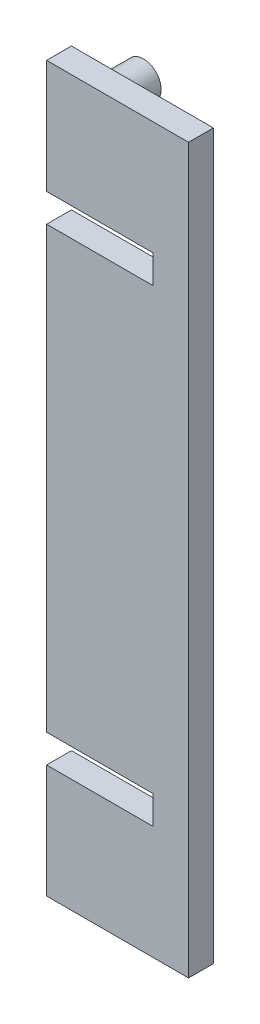
ISO-10303-21;
HEADER;
FILE_DESCRIPTION(('STEP AP214'),'2;1');
FILE_NAME('part.step','',(''),(''),'','','');
FILE_SCHEMA(('AUTOMOTIVE_DESIGN { 1 0 10303 214 1 1 1 1 }'));
ENDSEC;
DATA;
#1=APPLICATION_CONTEXT('core data for automotive mechanical design processes');
#2=APPLICATION_PROTOCOL_DEFINITION('international standard','automotive_design',2000,#1);
#3=PRODUCT_CONTEXT('',#1,'mechanical');
#4=PRODUCT('Part','Part','',(#3));
#5=PRODUCT_RELATED_PRODUCT_CATEGORY('part','',(#4));
#6=PRODUCT_DEFINITION_FORMATION('','',#4);
#7=PRODUCT_DEFINITION_CONTEXT('part definition',#1,'design');
#8=PRODUCT_DEFINITION('design','',#6,#7);
#9=PRODUCT_DEFINITION_SHAPE('','',#8);
#10=(LENGTH_UNIT() NAMED_UNIT(*) SI_UNIT(.MILLI.,.METRE.));
#11=(NAMED_UNIT(*) PLANE_ANGLE_UNIT() SI_UNIT($,.RADIAN.));
#12=(NAMED_UNIT(*) SI_UNIT($,.STERADIAN.) SOLID_ANGLE_UNIT());
#13=UNCERTAINTY_MEASURE_WITH_UNIT(LENGTH_MEASURE(1.E-05),#10,'distance_accuracy_value','');
#14=(GEOMETRIC_REPRESENTATION_CONTEXT(3) GLOBAL_UNCERTAINTY_ASSIGNED_CONTEXT((#13)) GLOBAL_UNIT_ASSIGNED_CONTEXT((#10,
#11,#12)) REPRESENTATION_CONTEXT('',''));
#15=CARTESIAN_POINT('',(0.,0.,0.));
#16=DIRECTION('',(0.,0.,1.));
#17=DIRECTION('',(1.,0.,0.));
#18=AXIS2_PLACEMENT_3D('',#15,#16,#17);
#19=CARTESIAN_POINT('',(3.18498825543047,0.,3.5));
#20=DIRECTION('',(-1.,0.,0.));
#21=DIRECTION('',(0.,0.,1.));
#22=AXIS2_PLACEMENT_3D('',#19,#20,#21);
#23=PLANE('',#22);
#24=DIRECTION('',(0.,1.,0.));
#25=VECTOR('',#24,1.);
#26=CARTESIAN_POINT('',(3.18498825543047,0.,3.5));
#27=LINE('',#26,#25);
#28=CARTESIAN_POINT('',(3.18498825543047,39.174258775512,3.5));
#29=VERTEX_POINT('',#28);
#30=CARTESIAN_POINT('',(3.18498825543047,43.174258775512,3.5));
#31=VERTEX_POINT('',#30);
#32=EDGE_CURVE('E195',#29,#31,#27,.T.);
#33=ORIENTED_EDGE('',*,*,#32,.T.);
#34=DIRECTION('',(0.,0.,1.));
#35=VECTOR('',#34,1.);
#36=CARTESIAN_POINT('',(3.18498825543047,43.174258775512,0.));
#37=LINE('',#36,#35);
#38=CARTESIAN_POINT('',(3.18498825543047,43.174258775512,0.));
#39=VERTEX_POINT('',#38);
#40=EDGE_CURVE('E152',#39,#31,#37,.T.);
#41=ORIENTED_EDGE('',*,*,#40,.F.);
#42=DIRECTION('',(0.,1.,0.));
#43=VECTOR('',#42,1.);
#44=CARTESIAN_POINT('',(3.18498825543047,0.,0.));
#45=LINE('',#44,#43);
#46=CARTESIAN_POINT('',(3.18498825543047,39.174258775512,0.));
#47=VERTEX_POINT('',#46);
#48=EDGE_CURVE('E158',#47,#39,#45,.T.);
#49=ORIENTED_EDGE('',*,*,#48,.F.);
#50=DIRECTION('',(0.,0.,-1.));
#51=VECTOR('',#50,1.);
#52=CARTESIAN_POINT('',(3.18498825543047,39.174258775512,3.5));
#53=LINE('',#52,#51);
#54=EDGE_CURVE('E229',#29,#47,#53,.T.);
#55=ORIENTED_EDGE('',*,*,#54,.F.);
#56=EDGE_LOOP('',(#33,#41,#49,#55));
#57=FACE_BOUND('',#56,.T.);
#58=ADVANCED_FACE('F43',(#57),#23,.T.);
#59=CARTESIAN_POINT('',(3.18498825543047,0.,3.5));
#60=DIRECTION('',(1.,0.,0.));
#61=DIRECTION('',(0.,0.,-1.));
#62=AXIS2_PLACEMENT_3D('',#59,#60,#61);
#63=PLANE('',#62);
#64=DIRECTION('',(0.,0.,-1.));
#65=VECTOR('',#64,1.);
#66=CARTESIAN_POINT('',(3.18498825543047,-26.825741224488,0.));
#67=LINE('',#66,#65);
#68=CARTESIAN_POINT('',(3.18498825543047,-26.825741224488,3.5));
#69=VERTEX_POINT('',#68);
#70=CARTESIAN_POINT('',(3.18498825543047,-26.825741224488,0.));
#71=VERTEX_POINT('',#70);
#72=EDGE_CURVE('E58',#69,#71,#67,.T.);
#73=ORIENTED_EDGE('',*,*,#72,.F.);
#74=DIRECTION('',(0.,-1.,0.));
#75=VECTOR('',#74,1.);
#76=CARTESIAN_POINT('',(3.18498825543047,0.,3.5));
#77=LINE('',#76,#75);
#78=CARTESIAN_POINT('',(3.18498825543047,-22.825741224488,3.5));
#79=VERTEX_POINT('',#78);
#80=EDGE_CURVE('E206',#79,#69,#77,.T.);
#81=ORIENTED_EDGE('',*,*,#80,.F.);
#82=DIRECTION('',(0.,0.,-1.));
#83=VECTOR('',#82,1.);
#84=CARTESIAN_POINT('',(3.18498825543047,-22.825741224488,3.5));
#85=LINE('',#84,#83);
#86=CARTESIAN_POINT('',(3.18498825543047,-22.825741224488,0.));
#87=VERTEX_POINT('',#86);
#88=EDGE_CURVE('E211',#79,#87,#85,.T.);
#89=ORIENTED_EDGE('',*,*,#88,.T.);
#90=DIRECTION('',(0.,-1.,0.));
#91=VECTOR('',#90,1.);
#92=CARTESIAN_POINT('',(3.18498825543047,0.,0.));
#93=LINE('',#92,#91);
#94=EDGE_CURVE('E63',#87,#71,#93,.T.);
#95=ORIENTED_EDGE('',*,*,#94,.T.);
#96=EDGE_LOOP('',(#73,#81,#89,#95));
#97=FACE_BOUND('',#96,.T.);
#98=ADVANCED_FACE('F271',(#97),#63,.F.);
#99=CARTESIAN_POINT('',(0.,59.174258775512,3.5));
#100=DIRECTION('',(0.,1.,0.));
#101=DIRECTION('',(0.,0.,1.));
#102=AXIS2_PLACEMENT_3D('',#99,#100,#101);
#103=PLANE('',#102);
#104=DIRECTION('',(0.,0.,1.));
#105=VECTOR('',#104,1.);
#106=CARTESIAN_POINT('',(8.18498825543047,59.174258775512,0.));
#107=LINE('',#106,#105);
#108=CARTESIAN_POINT('',(8.18498825543047,59.174258775512,0.));
#109=VERTEX_POINT('',#108);
#110=CARTESIAN_POINT('',(8.18498825543047,59.174258775512,3.5));
#111=VERTEX_POINT('',#110);
#112=EDGE_CURVE('E185',#109,#111,#107,.T.);
#113=ORIENTED_EDGE('',*,*,#112,.F.);
#114=DIRECTION('',(1.,0.,0.));
#115=VECTOR('',#114,1.);
#116=CARTESIAN_POINT('',(0.,59.174258775512,0.));
#117=LINE('',#116,#115);
#118=CARTESIAN_POINT('',(-11.8150117445695,59.174258775512,0.));
#119=VERTEX_POINT('',#118);
#120=EDGE_CURVE('E190',#119,#109,#117,.T.);
#121=ORIENTED_EDGE('',*,*,#120,.F.);
#122=DIRECTION('',(0.,0.,-1.));
#123=VECTOR('',#122,1.);
#124=CARTESIAN_POINT('',(-11.8150117445695,59.174258775512,0.));
#125=LINE('',#124,#123);
#126=CARTESIAN_POINT('',(-11.8150117445695,59.174258775512,3.5));
#127=VERTEX_POINT('',#126);
#128=EDGE_CURVE('E149',#127,#119,#125,.T.);
#129=ORIENTED_EDGE('',*,*,#128,.F.);
#130=DIRECTION('',(1.,0.,0.));
#131=VECTOR('',#130,1.);
#132=CARTESIAN_POINT('',(0.,59.174258775512,3.5));
#133=LINE('',#132,#131);
#134=EDGE_CURVE('E192',#127,#111,#133,.T.);
#135=ORIENTED_EDGE('',*,*,#134,.T.);
#136=EDGE_LOOP('',(#113,#121,#129,#135));
#137=FACE_BOUND('',#136,.T.);
#138=ADVANCED_FACE('F45',(#137),#103,.T.);
#139=CARTESIAN_POINT('',(0.,39.174258775512,3.5));
#140=DIRECTION('',(0.,1.,0.));
#141=DIRECTION('',(0.,0.,1.));
#142=AXIS2_PLACEMENT_3D('',#139,#140,#141);
#143=PLANE('',#142);
#144=DIRECTION('',(1.,0.,0.));
#145=VECTOR('',#144,1.);
#146=CARTESIAN_POINT('',(0.,39.174258775512,0.));
#147=LINE('',#146,#145);
#148=CARTESIAN_POINT('',(-11.8150117445695,39.174258775512,0.));
#149=VERTEX_POINT('',#148);
#150=EDGE_CURVE('E214',#149,#47,#147,.T.);
#151=ORIENTED_EDGE('',*,*,#150,.F.);
#152=DIRECTION('',(0.,0.,-1.));
#153=VECTOR('',#152,1.);
#154=CARTESIAN_POINT('',(-11.8150117445695,39.174258775512,3.5));
#155=LINE('',#154,#153);
#156=CARTESIAN_POINT('',(-11.8150117445695,39.174258775512,3.5));
#157=VERTEX_POINT('',#156);
#158=EDGE_CURVE('E227',#157,#149,#155,.T.);
#159=ORIENTED_EDGE('',*,*,#158,.F.);
#160=DIRECTION('',(1.,0.,0.));
#161=VECTOR('',#160,1.);
#162=CARTESIAN_POINT('',(0.,39.174258775512,3.5));
#163=LINE('',#162,#161);
#164=EDGE_CURVE('E199',#157,#29,#163,.T.);
#165=ORIENTED_EDGE('',*,*,#164,.T.);
#166=ORIENTED_EDGE('',*,*,#54,.T.);
#167=EDGE_LOOP('',(#151,#159,#165,#166));
#168=FACE_BOUND('',#167,.T.);
#169=ADVANCED_FACE('F279',(#168),#143,.T.);
#170=CARTESIAN_POINT('',(-11.8150117445695,0.,3.5));
#171=DIRECTION('',(1.,0.,0.));
#172=DIRECTION('',(0.,0.,-1.));
#173=AXIS2_PLACEMENT_3D('',#170,#171,#172);
#174=PLANE('',#173);
#175=DIRECTION('',(0.,-1.,0.));
#176=VECTOR('',#175,1.);
#177=CARTESIAN_POINT('',(-11.8150117445695,0.,0.));
#178=LINE('',#177,#176);
#179=CARTESIAN_POINT('',(-11.8150117445695,-22.825741224488,0.));
#180=VERTEX_POINT('',#179);
#181=EDGE_CURVE('E216',#149,#180,#178,.T.);
#182=ORIENTED_EDGE('',*,*,#181,.T.);
#183=DIRECTION('',(0.,0.,-1.));
#184=VECTOR('',#183,1.);
#185=CARTESIAN_POINT('',(-11.8150117445695,-22.825741224488,3.5));
#186=LINE('',#185,#184);
#187=CARTESIAN_POINT('',(-11.8150117445695,-22.825741224488,3.5));
#188=VERTEX_POINT('',#187);
#189=EDGE_CURVE('E224',#188,#180,#186,.T.);
#190=ORIENTED_EDGE('',*,*,#189,.F.);
#191=DIRECTION('',(0.,-1.,0.));
#192=VECTOR('',#191,1.);
#193=CARTESIAN_POINT('',(-11.8150117445695,0.,3.5));
#194=LINE('',#193,#192);
#195=EDGE_CURVE('E202',#157,#188,#194,.T.);
#196=ORIENTED_EDGE('',*,*,#195,.F.);
#197=ORIENTED_EDGE('',*,*,#158,.T.);
#198=EDGE_LOOP('',(#182,#190,#196,#197));
#199=FACE_BOUND('',#198,.T.);
#200=ADVANCED_FACE('F282',(#199),#174,.F.);
#201=CARTESIAN_POINT('',(0.,-22.825741224488,3.5));
#202=DIRECTION('',(0.,1.,0.));
#203=DIRECTION('',(0.,0.,1.));
#204=AXIS2_PLACEMENT_3D('',#201,#202,#203);
#205=PLANE('',#204);
#206=DIRECTION('',(1.,0.,0.));
#207=VECTOR('',#206,1.);
#208=CARTESIAN_POINT('',(0.,-22.825741224488,0.));
#209=LINE('',#208,#207);
#210=EDGE_CURVE('E218',#180,#87,#209,.T.);
#211=ORIENTED_EDGE('',*,*,#210,.T.);
#212=ORIENTED_EDGE('',*,*,#88,.F.);
#213=DIRECTION('',(1.,0.,0.));
#214=VECTOR('',#213,1.);
#215=CARTESIAN_POINT('',(0.,-22.825741224488,3.5));
#216=LINE('',#215,#214);
#217=EDGE_CURVE('E204',#188,#79,#216,.T.);
#218=ORIENTED_EDGE('',*,*,#217,.F.);
#219=ORIENTED_EDGE('',*,*,#189,.T.);
#220=EDGE_LOOP('',(#211,#212,#218,#219));
#221=FACE_BOUND('',#220,.T.);
#222=ADVANCED_FACE('F286',(#221),#205,.F.);
#223=CARTESIAN_POINT('',(0.,-42.825741224488,3.5));
#224=DIRECTION('',(0.,1.,0.));
#225=DIRECTION('',(0.,0.,1.));
#226=AXIS2_PLACEMENT_3D('',#223,#224,#225);
#227=PLANE('',#226);
#228=DIRECTION('',(1.,0.,0.));
#229=VECTOR('',#228,1.);
#230=CARTESIAN_POINT('',(0.,-42.825741224488,0.));
#231=LINE('',#230,#229);
#232=CARTESIAN_POINT('',(-11.8150117445695,-42.825741224488,0.));
#233=VERTEX_POINT('',#232);
#234=CARTESIAN_POINT('',(8.18498825543048,-42.825741224488,0.));
#235=VERTEX_POINT('',#234);
#236=EDGE_CURVE('E196',#233,#235,#231,.T.);
#237=ORIENTED_EDGE('',*,*,#236,.T.);
#238=DIRECTION('',(0.,0.,1.));
#239=VECTOR('',#238,1.);
#240=CARTESIAN_POINT('',(8.18498825543048,-42.825741224488,0.));
#241=LINE('',#240,#239);
#242=CARTESIAN_POINT('',(8.18498825543048,-42.825741224488,3.5));
#243=VERTEX_POINT('',#242);
#244=EDGE_CURVE('E187',#235,#243,#241,.T.);
#245=ORIENTED_EDGE('',*,*,#244,.T.);
#246=DIRECTION('',(1.,0.,0.));
#247=VECTOR('',#246,1.);
#248=CARTESIAN_POINT('',(0.,-42.825741224488,3.5));
#249=LINE('',#248,#247);
#250=CARTESIAN_POINT('',(-11.8150117445695,-42.825741224488,3.5));
#251=VERTEX_POINT('',#250);
#252=EDGE_CURVE('E208',#251,#243,#249,.T.);
#253=ORIENTED_EDGE('',*,*,#252,.F.);
#254=DIRECTION('',(0.,0.,1.));
#255=VECTOR('',#254,1.);
#256=CARTESIAN_POINT('',(-11.8150117445695,-42.825741224488,0.));
#257=LINE('',#256,#255);
#258=EDGE_CURVE('E179',#233,#251,#257,.T.);
#259=ORIENTED_EDGE('',*,*,#258,.F.);
#260=EDGE_LOOP('',(#237,#245,#253,#259));
#261=FACE_BOUND('',#260,.T.);
#262=ADVANCED_FACE('F289',(#261),#227,.F.);
#263=CARTESIAN_POINT('',(0.,0.,3.5));
#264=DIRECTION('',(0.,0.,1.));
#265=DIRECTION('',(1.,0.,0.));
#266=AXIS2_PLACEMENT_3D('',#263,#264,#265);
#267=PLANE('',#266);
#268=DIRECTION('',(0.,-1.,0.));
#269=VECTOR('',#268,1.);
#270=CARTESIAN_POINT('',(8.18498825543047,59.174258775512,3.5));
#271=LINE('',#270,#269);
#272=EDGE_CURVE('E159',#111,#243,#271,.T.);
#273=ORIENTED_EDGE('',*,*,#272,.F.);
#274=ORIENTED_EDGE('',*,*,#134,.F.);
#275=DIRECTION('',(0.,1.,0.));
#276=VECTOR('',#275,1.);
#277=CARTESIAN_POINT('',(-11.8150117445695,59.174258775512,3.5));
#278=LINE('',#277,#276);
#279=CARTESIAN_POINT('',(-11.8150117445695,43.174258775512,3.5));
#280=VERTEX_POINT('',#279);
#281=EDGE_CURVE('E142',#280,#127,#278,.T.);
#282=ORIENTED_EDGE('',*,*,#281,.F.);
#283=DIRECTION('',(1.,0.,0.));
#284=VECTOR('',#283,1.);
#285=CARTESIAN_POINT('',(-11.8150117445695,43.174258775512,3.5));
#286=LINE('',#285,#284);
#287=EDGE_CURVE('E138',#280,#31,#286,.T.);
#288=ORIENTED_EDGE('',*,*,#287,.T.);
#289=ORIENTED_EDGE('',*,*,#32,.F.);
#290=ORIENTED_EDGE('',*,*,#164,.F.);
#291=ORIENTED_EDGE('',*,*,#195,.T.);
#292=ORIENTED_EDGE('',*,*,#217,.T.);
#293=ORIENTED_EDGE('',*,*,#80,.T.);
#294=DIRECTION('',(1.,0.,0.));
#295=VECTOR('',#294,1.);
#296=CARTESIAN_POINT('',(-11.8150117445695,-26.825741224488,3.5));
#297=LINE('',#296,#295);
#298=CARTESIAN_POINT('',(-11.8150117445695,-26.825741224488,3.5));
#299=VERTEX_POINT('',#298);
#300=EDGE_CURVE('E166',#299,#69,#297,.T.);
#301=ORIENTED_EDGE('',*,*,#300,.F.);
#302=DIRECTION('',(0.,1.,0.));
#303=VECTOR('',#302,1.);
#304=CARTESIAN_POINT('',(-11.8150117445695,-42.825741224488,3.5));
#305=LINE('',#304,#303);
#306=EDGE_CURVE('E177',#251,#299,#305,.T.);
#307=ORIENTED_EDGE('',*,*,#306,.F.);
#308=ORIENTED_EDGE('',*,*,#252,.T.);
#309=EDGE_LOOP('',(#273,#274,#282,#288,#289,#290,#291,#292,#293,#301,#307,#308));
#310=FACE_BOUND('',#309,.T.);
#311=ADVANCED_FACE('F244',(#310),#267,.T.);
#312=CARTESIAN_POINT('',(0.,0.,0.));
#313=DIRECTION('',(0.,0.,1.));
#314=DIRECTION('',(1.,0.,0.));
#315=AXIS2_PLACEMENT_3D('',#312,#313,#314);
#316=PLANE('',#315);
#317=CARTESIAN_POINT('',(-6.66810682799379,-38.825741224488,0.));
#318=DIRECTION('',(0.,0.,1.));
#319=DIRECTION('',(1.,0.,0.));
#320=AXIS2_PLACEMENT_3D('',#317,#318,#319);
#321=CIRCLE('',#320,2.5);
#322=CARTESIAN_POINT('',(-4.16810682799379,-38.825741224488,0.));
#323=VERTEX_POINT('',#322);
#324=EDGE_CURVE('E11',#323,#323,#321,.F.);
#325=ORIENTED_EDGE('',*,*,#324,.F.);
#326=EDGE_LOOP('',(#325));
#327=FACE_BOUND('',#326,.T.);
#328=CARTESIAN_POINT('',(-6.66810682799379,1.17425877551197,0.));
#329=DIRECTION('',(0.,0.,1.));
#330=DIRECTION('',(1.,0.,0.));
#331=AXIS2_PLACEMENT_3D('',#328,#329,#330);
#332=CIRCLE('',#331,2.5);
#333=CARTESIAN_POINT('',(-4.16810682799379,1.17425877551197,0.));
#334=VERTEX_POINT('',#333);
#335=EDGE_CURVE('E51',#334,#334,#332,.F.);
#336=ORIENTED_EDGE('',*,*,#335,.F.);
#337=EDGE_LOOP('',(#336));
#338=FACE_BOUND('',#337,.T.);
#339=CARTESIAN_POINT('',(-6.66810682799379,15.174258775512,0.));
#340=DIRECTION('',(0.,0.,1.));
#341=DIRECTION('',(1.,0.,0.));
#342=AXIS2_PLACEMENT_3D('',#339,#340,#341);
#343=CIRCLE('',#342,2.5);
#344=CARTESIAN_POINT('',(-4.16810682799379,15.174258775512,0.));
#345=VERTEX_POINT('',#344);
#346=EDGE_CURVE('E234',#345,#345,#343,.F.);
#347=ORIENTED_EDGE('',*,*,#346,.F.);
#348=EDGE_LOOP('',(#347));
#349=FACE_BOUND('',#348,.T.);
#350=CARTESIAN_POINT('',(-6.66810682799379,55.174258775512,0.));
#351=DIRECTION('',(0.,0.,1.));
#352=DIRECTION('',(1.,0.,0.));
#353=AXIS2_PLACEMENT_3D('',#350,#351,#352);
#354=CIRCLE('',#353,2.5);
#355=CARTESIAN_POINT('',(-4.16810682799379,55.174258775512,0.));
#356=VERTEX_POINT('',#355);
#357=EDGE_CURVE('E231',#356,#356,#354,.F.);
#358=ORIENTED_EDGE('',*,*,#357,.F.);
#359=EDGE_LOOP('',(#358));
#360=FACE_BOUND('',#359,.T.);
#361=ORIENTED_EDGE('',*,*,#120,.T.);
#362=DIRECTION('',(0.,-1.,0.));
#363=VECTOR('',#362,1.);
#364=CARTESIAN_POINT('',(8.18498825543047,59.174258775512,0.));
#365=LINE('',#364,#363);
#366=EDGE_CURVE('E161',#109,#235,#365,.T.);
#367=ORIENTED_EDGE('',*,*,#366,.T.);
#368=ORIENTED_EDGE('',*,*,#236,.F.);
#369=DIRECTION('',(0.,-1.,0.));
#370=VECTOR('',#369,1.);
#371=CARTESIAN_POINT('',(-11.8150117445695,-42.825741224488,0.));
#372=LINE('',#371,#370);
#373=CARTESIAN_POINT('',(-11.8150117445695,-26.825741224488,0.));
#374=VERTEX_POINT('',#373);
#375=EDGE_CURVE('E175',#374,#233,#372,.T.);
#376=ORIENTED_EDGE('',*,*,#375,.F.);
#377=DIRECTION('',(1.,0.,0.));
#378=VECTOR('',#377,1.);
#379=CARTESIAN_POINT('',(-11.8150117445695,-26.825741224488,0.));
#380=LINE('',#379,#378);
#381=EDGE_CURVE('E169',#374,#71,#380,.T.);
#382=ORIENTED_EDGE('',*,*,#381,.T.);
#383=ORIENTED_EDGE('',*,*,#94,.F.);
#384=ORIENTED_EDGE('',*,*,#210,.F.);
#385=ORIENTED_EDGE('',*,*,#181,.F.);
#386=ORIENTED_EDGE('',*,*,#150,.T.);
#387=ORIENTED_EDGE('',*,*,#48,.T.);
#388=DIRECTION('',(1.,0.,0.));
#389=VECTOR('',#388,1.);
#390=CARTESIAN_POINT('',(-11.8150117445695,43.174258775512,0.));
#391=LINE('',#390,#389);
#392=CARTESIAN_POINT('',(-11.8150117445695,43.174258775512,0.));
#393=VERTEX_POINT('',#392);
#394=EDGE_CURVE('E135',#393,#39,#391,.T.);
#395=ORIENTED_EDGE('',*,*,#394,.F.);
#396=DIRECTION('',(0.,-1.,0.));
#397=VECTOR('',#396,1.);
#398=CARTESIAN_POINT('',(-11.8150117445695,59.174258775512,0.));
#399=LINE('',#398,#397);
#400=EDGE_CURVE('E143',#119,#393,#399,.T.);
#401=ORIENTED_EDGE('',*,*,#400,.F.);
#402=EDGE_LOOP('',(#361,#367,#368,#376,#382,#383,#384,#385,#386,#387,#395,#401));
#403=FACE_BOUND('',#402,.T.);
#404=ADVANCED_FACE('F155',(#327,#338,#349,#360,#403),#316,.F.);
#405=CARTESIAN_POINT('',(8.18498825543047,59.174258775512,0.));
#406=DIRECTION('',(-1.,0.,0.));
#407=DIRECTION('',(0.,-1.,0.));
#408=AXIS2_PLACEMENT_3D('',#405,#406,#407);
#409=PLANE('',#408);
#410=ORIENTED_EDGE('',*,*,#272,.T.);
#411=ORIENTED_EDGE('',*,*,#244,.F.);
#412=ORIENTED_EDGE('',*,*,#366,.F.);
#413=ORIENTED_EDGE('',*,*,#112,.T.);
#414=EDGE_LOOP('',(#410,#411,#412,#413));
#415=FACE_BOUND('',#414,.T.);
#416=ADVANCED_FACE('F243',(#415),#409,.F.);
#417=CARTESIAN_POINT('',(-11.8150117445695,-26.825741224488,0.));
#418=DIRECTION('',(0.,-1.,0.));
#419=DIRECTION('',(0.,0.,-1.));
#420=AXIS2_PLACEMENT_3D('',#417,#418,#419);
#421=PLANE('',#420);
#422=ORIENTED_EDGE('',*,*,#72,.T.);
#423=ORIENTED_EDGE('',*,*,#381,.F.);
#424=DIRECTION('',(0.,0.,-1.));
#425=VECTOR('',#424,1.);
#426=CARTESIAN_POINT('',(-11.8150117445695,-26.825741224488,0.));
#427=LINE('',#426,#425);
#428=EDGE_CURVE('E173',#299,#374,#427,.T.);
#429=ORIENTED_EDGE('',*,*,#428,.F.);
#430=ORIENTED_EDGE('',*,*,#300,.T.);
#431=EDGE_LOOP('',(#422,#423,#429,#430));
#432=FACE_BOUND('',#431,.T.);
#433=ADVANCED_FACE('F299',(#432),#421,.F.);
#434=CARTESIAN_POINT('',(-11.8150117445695,0.,0.));
#435=DIRECTION('',(1.,0.,0.));
#436=DIRECTION('',(0.,0.,-1.));
#437=AXIS2_PLACEMENT_3D('',#434,#435,#436);
#438=PLANE('',#437);
#439=ORIENTED_EDGE('',*,*,#375,.T.);
#440=ORIENTED_EDGE('',*,*,#258,.T.);
#441=ORIENTED_EDGE('',*,*,#306,.T.);
#442=ORIENTED_EDGE('',*,*,#428,.T.);
#443=EDGE_LOOP('',(#439,#440,#441,#442));
#444=FACE_BOUND('',#443,.T.);
#445=ADVANCED_FACE('F301',(#444),#438,.F.);
#446=CARTESIAN_POINT('',(-11.8150117445695,43.174258775512,0.));
#447=DIRECTION('',(0.,1.,0.));
#448=DIRECTION('',(0.,0.,1.));
#449=AXIS2_PLACEMENT_3D('',#446,#447,#448);
#450=PLANE('',#449);
#451=ORIENTED_EDGE('',*,*,#40,.T.);
#452=ORIENTED_EDGE('',*,*,#287,.F.);
#453=DIRECTION('',(0.,0.,1.));
#454=VECTOR('',#453,1.);
#455=CARTESIAN_POINT('',(-11.8150117445695,43.174258775512,0.));
#456=LINE('',#455,#454);
#457=EDGE_CURVE('E131',#393,#280,#456,.T.);
#458=ORIENTED_EDGE('',*,*,#457,.F.);
#459=ORIENTED_EDGE('',*,*,#394,.T.);
#460=EDGE_LOOP('',(#451,#452,#458,#459));
#461=FACE_BOUND('',#460,.T.);
#462=ADVANCED_FACE('F133',(#461),#450,.F.);
#463=CARTESIAN_POINT('',(-11.8150117445695,0.,0.));
#464=DIRECTION('',(-1.,0.,0.));
#465=DIRECTION('',(0.,0.,1.));
#466=AXIS2_PLACEMENT_3D('',#463,#464,#465);
#467=PLANE('',#466);
#468=ORIENTED_EDGE('',*,*,#400,.T.);
#469=ORIENTED_EDGE('',*,*,#457,.T.);
#470=ORIENTED_EDGE('',*,*,#281,.T.);
#471=ORIENTED_EDGE('',*,*,#128,.T.);
#472=EDGE_LOOP('',(#468,#469,#470,#471));
#473=FACE_BOUND('',#472,.T.);
#474=ADVANCED_FACE('F147',(#473),#467,.T.);
#475=CARTESIAN_POINT('',(-6.66810682799379,55.174258775512,-5.));
#476=DIRECTION('',(0.,0.,-1.));
#477=DIRECTION('',(-1.,0.,0.));
#478=AXIS2_PLACEMENT_3D('',#475,#476,#477);
#479=PLANE('',#478);
#480=CARTESIAN_POINT('',(-6.66810682799379,55.174258775512,-5.));
#481=DIRECTION('',(0.,0.,-1.));
#482=DIRECTION('',(-1.,0.,0.));
#483=AXIS2_PLACEMENT_3D('',#480,#481,#482);
#484=CIRCLE('',#483,2.5);
#485=CARTESIAN_POINT('',(-9.16810682799379,55.174258775512,-5.));
#486=VERTEX_POINT('',#485);
#487=EDGE_CURVE('E487',#486,#486,#484,.T.);
#488=ORIENTED_EDGE('',*,*,#487,.T.);
#489=EDGE_LOOP('',(#488));
#490=FACE_BOUND('',#489,.T.);
#491=CARTESIAN_POINT('',(-6.66810682799379,55.174258775512,-5.));
#492=DIRECTION('',(0.,0.,-1.));
#493=DIRECTION('',(-1.,0.,0.));
#494=AXIS2_PLACEMENT_3D('',#491,#492,#493);
#495=CIRCLE('',#494,1.25);
#496=CARTESIAN_POINT('',(-7.91810682799379,55.174258775512,-5.));
#497=VERTEX_POINT('',#496);
#498=EDGE_CURVE('E490',#497,#497,#495,.T.);
#499=ORIENTED_EDGE('',*,*,#498,.F.);
#500=EDGE_LOOP('',(#499));
#501=FACE_BOUND('',#500,.T.);
#502=ADVANCED_FACE('F256',(#490,#501),#479,.T.);
#503=CARTESIAN_POINT('',(-6.66810682799379,55.174258775512,-5.));
#504=DIRECTION('',(0.,0.,1.));
#505=DIRECTION('',(1.,0.,0.));
#506=AXIS2_PLACEMENT_3D('',#503,#504,#505);
#507=CYLINDRICAL_SURFACE('',#506,2.5);
#508=ORIENTED_EDGE('',*,*,#487,.F.);
#509=EDGE_LOOP('',(#508));
#510=FACE_BOUND('',#509,.T.);
#511=ORIENTED_EDGE('',*,*,#357,.T.);
#512=EDGE_LOOP('',(#511));
#513=FACE_BOUND('',#512,.T.);
#514=ADVANCED_FACE('F253',(#510,#513),#507,.T.);
#515=CARTESIAN_POINT('',(-6.66810682799379,55.174258775512,-5.));
#516=DIRECTION('',(0.,0.,1.));
#517=DIRECTION('',(1.,0.,0.));
#518=AXIS2_PLACEMENT_3D('',#515,#516,#517);
#519=CYLINDRICAL_SURFACE('',#518,1.25);
#520=ORIENTED_EDGE('',*,*,#498,.T.);
#521=EDGE_LOOP('',(#520));
#522=FACE_BOUND('',#521,.T.);
#523=CARTESIAN_POINT('',(-6.66810682799379,55.174258775512,0.));
#524=DIRECTION('',(0.,0.,-1.));
#525=DIRECTION('',(-1.,0.,0.));
#526=AXIS2_PLACEMENT_3D('',#523,#524,#525);
#527=CIRCLE('',#526,1.25);
#528=CARTESIAN_POINT('',(-7.91810682799379,55.174258775512,0.));
#529=VERTEX_POINT('',#528);
#530=EDGE_CURVE('E482',#529,#529,#527,.T.);
#531=ORIENTED_EDGE('',*,*,#530,.F.);
#532=EDGE_LOOP('',(#531));
#533=FACE_BOUND('',#532,.T.);
#534=ADVANCED_FACE('F255',(#522,#533),#519,.F.);
#535=CARTESIAN_POINT('',(-6.66810682799379,15.174258775512,-5.));
#536=DIRECTION('',(0.,0.,-1.));
#537=DIRECTION('',(-1.,0.,0.));
#538=AXIS2_PLACEMENT_3D('',#535,#536,#537);
#539=PLANE('',#538);
#540=CARTESIAN_POINT('',(-6.66810682799379,15.174258775512,-5.));
#541=DIRECTION('',(0.,0.,-1.));
#542=DIRECTION('',(-1.,0.,0.));
#543=AXIS2_PLACEMENT_3D('',#540,#541,#542);
#544=CIRCLE('',#543,2.5);
#545=CARTESIAN_POINT('',(-9.16810682799379,15.174258775512,-5.));
#546=VERTEX_POINT('',#545);
#547=EDGE_CURVE('E478',#546,#546,#544,.T.);
#548=ORIENTED_EDGE('',*,*,#547,.T.);
#549=EDGE_LOOP('',(#548));
#550=FACE_BOUND('',#549,.T.);
#551=CARTESIAN_POINT('',(-6.66810682799379,15.174258775512,-5.));
#552=DIRECTION('',(0.,0.,-1.));
#553=DIRECTION('',(-1.,0.,0.));
#554=AXIS2_PLACEMENT_3D('',#551,#552,#553);
#555=CIRCLE('',#554,1.25);
#556=CARTESIAN_POINT('',(-7.91810682799379,15.174258775512,-5.));
#557=VERTEX_POINT('',#556);
#558=EDGE_CURVE('E481',#557,#557,#555,.T.);
#559=ORIENTED_EDGE('',*,*,#558,.F.);
#560=EDGE_LOOP('',(#559));
#561=FACE_BOUND('',#560,.T.);
#562=ADVANCED_FACE('F263',(#550,#561),#539,.T.);
#563=CARTESIAN_POINT('',(-6.66810682799379,15.174258775512,-5.));
#564=DIRECTION('',(0.,0.,1.));
#565=DIRECTION('',(1.,0.,0.));
#566=AXIS2_PLACEMENT_3D('',#563,#564,#565);
#567=CYLINDRICAL_SURFACE('',#566,2.5);
#568=ORIENTED_EDGE('',*,*,#547,.F.);
#569=EDGE_LOOP('',(#568));
#570=FACE_BOUND('',#569,.T.);
#571=ORIENTED_EDGE('',*,*,#346,.T.);
#572=EDGE_LOOP('',(#571));
#573=FACE_BOUND('',#572,.T.);
#574=ADVANCED_FACE('F352',(#570,#573),#567,.T.);
#575=CARTESIAN_POINT('',(-6.66810682799379,15.174258775512,-5.));
#576=DIRECTION('',(0.,0.,1.));
#577=DIRECTION('',(1.,0.,0.));
#578=AXIS2_PLACEMENT_3D('',#575,#576,#577);
#579=CYLINDRICAL_SURFACE('',#578,1.25);
#580=ORIENTED_EDGE('',*,*,#558,.T.);
#581=EDGE_LOOP('',(#580));
#582=FACE_BOUND('',#581,.T.);
#583=CARTESIAN_POINT('',(-6.66810682799379,15.174258775512,0.));
#584=DIRECTION('',(0.,0.,-1.));
#585=DIRECTION('',(-1.,0.,0.));
#586=AXIS2_PLACEMENT_3D('',#583,#584,#585);
#587=CIRCLE('',#586,1.25);
#588=CARTESIAN_POINT('',(-7.91810682799379,15.174258775512,0.));
#589=VERTEX_POINT('',#588);
#590=EDGE_CURVE('E474',#589,#589,#587,.T.);
#591=ORIENTED_EDGE('',*,*,#590,.F.);
#592=EDGE_LOOP('',(#591));
#593=FACE_BOUND('',#592,.T.);
#594=ADVANCED_FACE('F362',(#582,#593),#579,.F.);
#595=CARTESIAN_POINT('',(-6.66810682799379,1.17425877551197,-5.));
#596=DIRECTION('',(0.,0.,-1.));
#597=DIRECTION('',(-1.,0.,0.));
#598=AXIS2_PLACEMENT_3D('',#595,#596,#597);
#599=PLANE('',#598);
#600=CARTESIAN_POINT('',(-6.66810682799379,1.17425877551197,-5.));
#601=DIRECTION('',(0.,0.,-1.));
#602=DIRECTION('',(-1.,0.,0.));
#603=AXIS2_PLACEMENT_3D('',#600,#601,#602);
#604=CIRCLE('',#603,2.5);
#605=CARTESIAN_POINT('',(-9.16810682799379,1.17425877551197,-5.));
#606=VERTEX_POINT('',#605);
#607=EDGE_CURVE('E472',#606,#606,#604,.T.);
#608=ORIENTED_EDGE('',*,*,#607,.T.);
#609=EDGE_LOOP('',(#608));
#610=FACE_BOUND('',#609,.T.);
#611=CARTESIAN_POINT('',(-6.66810682799379,1.17425877551197,-5.));
#612=DIRECTION('',(0.,0.,-1.));
#613=DIRECTION('',(-1.,0.,0.));
#614=AXIS2_PLACEMENT_3D('',#611,#612,#613);
#615=CIRCLE('',#614,1.25);
#616=CARTESIAN_POINT('',(-7.91810682799379,1.17425877551197,-5.));
#617=VERTEX_POINT('',#616);
#618=EDGE_CURVE('E467',#617,#617,#615,.T.);
#619=ORIENTED_EDGE('',*,*,#618,.F.);
#620=EDGE_LOOP('',(#619));
#621=FACE_BOUND('',#620,.T.);
#622=ADVANCED_FACE('F372',(#610,#621),#599,.T.);
#623=CARTESIAN_POINT('',(-6.66810682799379,1.17425877551197,-5.));
#624=DIRECTION('',(0.,0.,1.));
#625=DIRECTION('',(1.,0.,0.));
#626=AXIS2_PLACEMENT_3D('',#623,#624,#625);
#627=CYLINDRICAL_SURFACE('',#626,2.5);
#628=ORIENTED_EDGE('',*,*,#607,.F.);
#629=EDGE_LOOP('',(#628));
#630=FACE_BOUND('',#629,.T.);
#631=ORIENTED_EDGE('',*,*,#335,.T.);
#632=EDGE_LOOP('',(#631));
#633=FACE_BOUND('',#632,.T.);
#634=ADVANCED_FACE('F239',(#630,#633),#627,.T.);
#635=CARTESIAN_POINT('',(-6.66810682799379,1.17425877551197,-5.));
#636=DIRECTION('',(0.,0.,1.));
#637=DIRECTION('',(1.,0.,0.));
#638=AXIS2_PLACEMENT_3D('',#635,#636,#637);
#639=CYLINDRICAL_SURFACE('',#638,1.25);
#640=ORIENTED_EDGE('',*,*,#618,.T.);
#641=EDGE_LOOP('',(#640));
#642=FACE_BOUND('',#641,.T.);
#643=CARTESIAN_POINT('',(-6.66810682799379,1.17425877551197,0.));
#644=DIRECTION('',(0.,0.,-1.));
#645=DIRECTION('',(-1.,0.,0.));
#646=AXIS2_PLACEMENT_3D('',#643,#644,#645);
#647=CIRCLE('',#646,1.25);
#648=CARTESIAN_POINT('',(-7.91810682799379,1.17425877551197,0.));
#649=VERTEX_POINT('',#648);
#650=EDGE_CURVE('E462',#649,#649,#647,.T.);
#651=ORIENTED_EDGE('',*,*,#650,.F.);
#652=EDGE_LOOP('',(#651));
#653=FACE_BOUND('',#652,.T.);
#654=ADVANCED_FACE('F390',(#642,#653),#639,.F.);
#655=CARTESIAN_POINT('',(-6.66810682799379,-38.825741224488,-5.));
#656=DIRECTION('',(0.,0.,-1.));
#657=DIRECTION('',(-1.,0.,0.));
#658=AXIS2_PLACEMENT_3D('',#655,#656,#657);
#659=PLANE('',#658);
#660=CARTESIAN_POINT('',(-6.66810682799379,-38.825741224488,-5.));
#661=DIRECTION('',(0.,0.,-1.));
#662=DIRECTION('',(-1.,0.,0.));
#663=AXIS2_PLACEMENT_3D('',#660,#661,#662);
#664=CIRCLE('',#663,2.5);
#665=CARTESIAN_POINT('',(-9.16810682799379,-38.825741224488,-5.));
#666=VERTEX_POINT('',#665);
#667=EDGE_CURVE('E170',#666,#666,#664,.T.);
#668=ORIENTED_EDGE('',*,*,#667,.T.);
#669=EDGE_LOOP('',(#668));
#670=FACE_BOUND('',#669,.T.);
#671=CARTESIAN_POINT('',(-6.66810682799379,-38.825741224488,-5.));
#672=DIRECTION('',(0.,0.,-1.));
#673=DIRECTION('',(-1.,0.,0.));
#674=AXIS2_PLACEMENT_3D('',#671,#672,#673);
#675=CIRCLE('',#674,1.25);
#676=CARTESIAN_POINT('',(-7.91810682799379,-38.825741224488,-5.));
#677=VERTEX_POINT('',#676);
#678=EDGE_CURVE('E461',#677,#677,#675,.T.);
#679=ORIENTED_EDGE('',*,*,#678,.F.);
#680=EDGE_LOOP('',(#679));
#681=FACE_BOUND('',#680,.T.);
#682=ADVANCED_FACE('F400',(#670,#681),#659,.T.);
#683=CARTESIAN_POINT('',(-6.66810682799379,-38.825741224488,-5.));
#684=DIRECTION('',(0.,0.,1.));
#685=DIRECTION('',(1.,0.,0.));
#686=AXIS2_PLACEMENT_3D('',#683,#684,#685);
#687=CYLINDRICAL_SURFACE('',#686,2.5);
#688=ORIENTED_EDGE('',*,*,#667,.F.);
#689=EDGE_LOOP('',(#688));
#690=FACE_BOUND('',#689,.T.);
#691=ORIENTED_EDGE('',*,*,#324,.T.);
#692=EDGE_LOOP('',(#691));
#693=FACE_BOUND('',#692,.T.);
#694=ADVANCED_FACE('F410',(#690,#693),#687,.T.);
#695=CARTESIAN_POINT('',(-6.66810682799379,-38.825741224488,-5.));
#696=DIRECTION('',(0.,0.,1.));
#697=DIRECTION('',(1.,0.,0.));
#698=AXIS2_PLACEMENT_3D('',#695,#696,#697);
#699=CYLINDRICAL_SURFACE('',#698,1.25);
#700=ORIENTED_EDGE('',*,*,#678,.T.);
#701=EDGE_LOOP('',(#700));
#702=FACE_BOUND('',#701,.T.);
#703=CARTESIAN_POINT('',(-6.66810682799379,-38.825741224488,0.));
#704=DIRECTION('',(0.,0.,-1.));
#705=DIRECTION('',(-1.,0.,0.));
#706=AXIS2_PLACEMENT_3D('',#703,#704,#705);
#707=CIRCLE('',#706,1.25);
#708=CARTESIAN_POINT('',(-7.91810682799379,-38.825741224488,0.));
#709=VERTEX_POINT('',#708);
#710=EDGE_CURVE('E459',#709,#709,#707,.T.);
#711=ORIENTED_EDGE('',*,*,#710,.F.);
#712=EDGE_LOOP('',(#711));
#713=FACE_BOUND('',#712,.T.);
#714=ADVANCED_FACE('F420',(#702,#713),#699,.F.);
#715=ORIENTED_EDGE('',*,*,#530,.T.);
#716=EDGE_LOOP('',(#715));
#717=FACE_BOUND('',#716,.T.);
#718=ADVANCED_FACE('F248',(#717),#316,.F.);
#719=ORIENTED_EDGE('',*,*,#590,.T.);
#720=EDGE_LOOP('',(#719));
#721=FACE_BOUND('',#720,.T.);
#722=ADVANCED_FACE('F437',(#721),#316,.F.);
#723=ORIENTED_EDGE('',*,*,#650,.T.);
#724=EDGE_LOOP('',(#723));
#725=FACE_BOUND('',#724,.T.);
#726=ADVANCED_FACE('F444',(#725),#316,.F.);
#727=ORIENTED_EDGE('',*,*,#710,.T.);
#728=EDGE_LOOP('',(#727));
#729=FACE_BOUND('',#728,.T.);
#730=ADVANCED_FACE('F247',(#729),#316,.F.);
#731=CLOSED_SHELL('',(#58,#98,#138,#169,#200,#222,#262,#311,#404,#416,#433,#445,#462,#474,#502,
#514,#534,#562,#574,#594,#622,#634,#654,#682,#694,#714,#718,#722,#726,#730));
#732=MANIFOLD_SOLID_BREP('B2',#731);
#733=ADVANCED_BREP_SHAPE_REPRESENTATION('',(#18,#732),#14);
#734=SHAPE_DEFINITION_REPRESENTATION(#9,#733);
ENDSEC;
END-ISO-10303-21;
